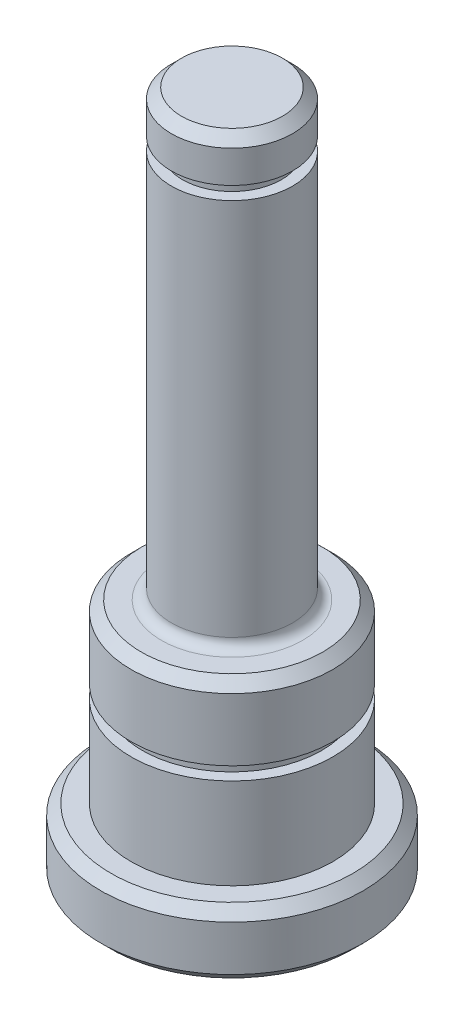
ISO-10303-21;
HEADER;
FILE_DESCRIPTION(('STEP AP214'),'2;1');
FILE_NAME('part.step','',(''),(''),'','','');
FILE_SCHEMA(('AUTOMOTIVE_DESIGN { 1 0 10303 214 1 1 1 1 }'));
ENDSEC;
DATA;
#1=APPLICATION_CONTEXT('core data for automotive mechanical design processes');
#2=APPLICATION_PROTOCOL_DEFINITION('international standard','automotive_design',2000,#1);
#3=PRODUCT_CONTEXT('',#1,'mechanical');
#4=PRODUCT('Part','Part','',(#3));
#5=PRODUCT_RELATED_PRODUCT_CATEGORY('part','',(#4));
#6=PRODUCT_DEFINITION_FORMATION('','',#4);
#7=PRODUCT_DEFINITION_CONTEXT('part definition',#1,'design');
#8=PRODUCT_DEFINITION('design','',#6,#7);
#9=PRODUCT_DEFINITION_SHAPE('','',#8);
#10=(LENGTH_UNIT() NAMED_UNIT(*) SI_UNIT(.MILLI.,.METRE.));
#11=(NAMED_UNIT(*) PLANE_ANGLE_UNIT() SI_UNIT($,.RADIAN.));
#12=(NAMED_UNIT(*) SI_UNIT($,.STERADIAN.) SOLID_ANGLE_UNIT());
#13=UNCERTAINTY_MEASURE_WITH_UNIT(LENGTH_MEASURE(1.E-05),#10,'distance_accuracy_value','');
#14=(GEOMETRIC_REPRESENTATION_CONTEXT(3) GLOBAL_UNCERTAINTY_ASSIGNED_CONTEXT((#13)) GLOBAL_UNIT_ASSIGNED_CONTEXT((#10,
#11,#12)) REPRESENTATION_CONTEXT('',''));
#15=CARTESIAN_POINT('',(0.,0.,0.));
#16=DIRECTION('',(0.,0.,1.));
#17=DIRECTION('',(1.,0.,0.));
#18=AXIS2_PLACEMENT_3D('',#15,#16,#17);
#19=CARTESIAN_POINT('',(-10.,15.5,0.));
#20=DIRECTION('',(0.,-1.,0.));
#21=DIRECTION('',(1.,0.,0.));
#22=AXIS2_PLACEMENT_3D('',#19,#20,#21);
#23=PLANE('',#22);
#24=CARTESIAN_POINT('',(0.,15.5,0.));
#25=DIRECTION('',(0.,-1.,0.));
#26=DIRECTION('',(1.,0.,0.));
#27=AXIS2_PLACEMENT_3D('',#24,#25,#26);
#28=CIRCLE('',#27,10.);
#29=CARTESIAN_POINT('',(10.,15.5,0.));
#30=VERTEX_POINT('',#29);
#31=EDGE_CURVE('E77',#30,#30,#28,.T.);
#32=ORIENTED_EDGE('',*,*,#31,.F.);
#33=EDGE_LOOP('',(#32));
#34=FACE_BOUND('',#33,.T.);
#35=CARTESIAN_POINT('',(0.,15.5,0.));
#36=DIRECTION('',(0.,-1.,0.));
#37=DIRECTION('',(1.,0.,0.));
#38=AXIS2_PLACEMENT_3D('',#35,#36,#37);
#39=CIRCLE('',#38,8.9);
#40=CARTESIAN_POINT('',(8.9,15.5,0.));
#41=VERTEX_POINT('',#40);
#42=EDGE_CURVE('E104',#41,#41,#39,.T.);
#43=ORIENTED_EDGE('',*,*,#42,.T.);
#44=EDGE_LOOP('',(#43));
#45=FACE_BOUND('',#44,.T.);
#46=ADVANCED_FACE('F33',(#34,#45),#23,.F.);
#47=CARTESIAN_POINT('',(0.,0.,0.));
#48=DIRECTION('',(0.,-1.,0.));
#49=DIRECTION('',(1.,0.,0.));
#50=AXIS2_PLACEMENT_3D('',#47,#48,#49);
#51=CYLINDRICAL_SURFACE('',#50,10.);
#52=CARTESIAN_POINT('',(0.,6.5,0.));
#53=DIRECTION('',(0.,-1.,0.));
#54=DIRECTION('',(1.,0.,0.));
#55=AXIS2_PLACEMENT_3D('',#52,#53,#54);
#56=CIRCLE('',#55,10.);
#57=CARTESIAN_POINT('',(10.,6.5,0.));
#58=VERTEX_POINT('',#57);
#59=EDGE_CURVE('E80',#58,#58,#56,.T.);
#60=ORIENTED_EDGE('',*,*,#59,.F.);
#61=EDGE_LOOP('',(#60));
#62=FACE_BOUND('',#61,.T.);
#63=ORIENTED_EDGE('',*,*,#31,.T.);
#64=EDGE_LOOP('',(#63));
#65=FACE_BOUND('',#64,.T.);
#66=ADVANCED_FACE('F133',(#62,#65),#51,.T.);
#67=CARTESIAN_POINT('',(-13.,6.5,0.));
#68=DIRECTION('',(0.,-1.,0.));
#69=DIRECTION('',(1.,0.,0.));
#70=AXIS2_PLACEMENT_3D('',#67,#68,#69);
#71=PLANE('',#70);
#72=CARTESIAN_POINT('',(0.,6.5,0.));
#73=DIRECTION('',(0.,-1.,0.));
#74=DIRECTION('',(1.,0.,0.));
#75=AXIS2_PLACEMENT_3D('',#72,#73,#74);
#76=CIRCLE('',#75,12.);
#77=CARTESIAN_POINT('',(12.,6.5,0.));
#78=VERTEX_POINT('',#77);
#79=EDGE_CURVE('E56',#78,#78,#76,.F.);
#80=ORIENTED_EDGE('',*,*,#79,.T.);
#81=EDGE_LOOP('',(#80));
#82=FACE_BOUND('',#81,.T.);
#83=ORIENTED_EDGE('',*,*,#59,.T.);
#84=EDGE_LOOP('',(#83));
#85=FACE_BOUND('',#84,.T.);
#86=ADVANCED_FACE('F139',(#82,#85),#71,.F.);
#87=CARTESIAN_POINT('',(0.,0.,0.));
#88=DIRECTION('',(0.,-1.,0.));
#89=DIRECTION('',(1.,0.,0.));
#90=AXIS2_PLACEMENT_3D('',#87,#88,#89);
#91=CYLINDRICAL_SURFACE('',#90,13.);
#92=CARTESIAN_POINT('',(0.,5.49999999999999,0.));
#93=DIRECTION('',(0.,-1.,0.));
#94=DIRECTION('',(1.,0.,0.));
#95=AXIS2_PLACEMENT_3D('',#92,#93,#94);
#96=CIRCLE('',#95,13.);
#97=CARTESIAN_POINT('',(13.,5.49999999999999,0.));
#98=VERTEX_POINT('',#97);
#99=EDGE_CURVE('E59',#98,#98,#96,.T.);
#100=ORIENTED_EDGE('',*,*,#99,.T.);
#101=EDGE_LOOP('',(#100));
#102=FACE_BOUND('',#101,.T.);
#103=CARTESIAN_POINT('',(0.,0.999999999999979,0.));
#104=DIRECTION('',(0.,1.,0.));
#105=DIRECTION('',(-1.,0.,0.));
#106=AXIS2_PLACEMENT_3D('',#103,#104,#105);
#107=CIRCLE('',#106,13.);
#108=CARTESIAN_POINT('',(-13.,0.999999999999979,0.));
#109=VERTEX_POINT('',#108);
#110=EDGE_CURVE('E62',#109,#109,#107,.T.);
#111=ORIENTED_EDGE('',*,*,#110,.T.);
#112=EDGE_LOOP('',(#111));
#113=FACE_BOUND('',#112,.T.);
#114=ADVANCED_FACE('F188',(#102,#113),#91,.T.);
#115=CARTESIAN_POINT('',(-5.,0.,0.));
#116=DIRECTION('',(0.,1.,0.));
#117=DIRECTION('',(-1.,0.,0.));
#118=AXIS2_PLACEMENT_3D('',#115,#116,#117);
#119=PLANE('',#118);
#120=CARTESIAN_POINT('',(0.,0.,0.));
#121=DIRECTION('',(0.,1.,0.));
#122=DIRECTION('',(-1.,0.,0.));
#123=AXIS2_PLACEMENT_3D('',#120,#121,#122);
#124=CIRCLE('',#123,6.);
#125=CARTESIAN_POINT('',(-6.,0.,0.));
#126=VERTEX_POINT('',#125);
#127=EDGE_CURVE('E44',#126,#126,#124,.T.);
#128=ORIENTED_EDGE('',*,*,#127,.T.);
#129=EDGE_LOOP('',(#128));
#130=FACE_BOUND('',#129,.T.);
#131=CARTESIAN_POINT('',(0.,0.,0.));
#132=DIRECTION('',(0.,1.,0.));
#133=DIRECTION('',(-1.,0.,0.));
#134=AXIS2_PLACEMENT_3D('',#131,#132,#133);
#135=CIRCLE('',#134,12.);
#136=CARTESIAN_POINT('',(-12.,0.,0.));
#137=VERTEX_POINT('',#136);
#138=EDGE_CURVE('E48',#137,#137,#135,.F.);
#139=ORIENTED_EDGE('',*,*,#138,.T.);
#140=EDGE_LOOP('',(#139));
#141=FACE_BOUND('',#140,.T.);
#142=ADVANCED_FACE('F185',(#130,#141),#119,.F.);
#143=CARTESIAN_POINT('',(0.,0.,0.));
#144=DIRECTION('',(0.,-1.,0.));
#145=DIRECTION('',(1.,0.,0.));
#146=AXIS2_PLACEMENT_3D('',#143,#144,#145);
#147=CYLINDRICAL_SURFACE('',#146,5.);
#148=CARTESIAN_POINT('',(0.,1.,0.));
#149=DIRECTION('',(0.,1.,0.));
#150=DIRECTION('',(-1.,0.,0.));
#151=AXIS2_PLACEMENT_3D('',#148,#149,#150);
#152=CIRCLE('',#151,5.);
#153=CARTESIAN_POINT('',(-5.,1.,0.));
#154=VERTEX_POINT('',#153);
#155=EDGE_CURVE('E53',#154,#154,#152,.F.);
#156=ORIENTED_EDGE('',*,*,#155,.T.);
#157=EDGE_LOOP('',(#156));
#158=FACE_BOUND('',#157,.T.);
#159=CARTESIAN_POINT('',(0.,18.,0.));
#160=DIRECTION('',(0.,-1.,0.));
#161=DIRECTION('',(1.,0.,0.));
#162=AXIS2_PLACEMENT_3D('',#159,#160,#161);
#163=CIRCLE('',#162,5.);
#164=CARTESIAN_POINT('',(5.,18.,0.));
#165=VERTEX_POINT('',#164);
#166=EDGE_CURVE('E83',#165,#165,#163,.T.);
#167=ORIENTED_EDGE('',*,*,#166,.F.);
#168=EDGE_LOOP('',(#167));
#169=FACE_BOUND('',#168,.T.);
#170=ADVANCED_FACE('F187',(#158,#169),#147,.F.);
#171=CARTESIAN_POINT('',(0.,18.,0.));
#172=DIRECTION('',(0.,1.,0.));
#173=DIRECTION('',(-1.,0.,0.));
#174=AXIS2_PLACEMENT_3D('',#171,#172,#173);
#175=PLANE('',#174);
#176=ORIENTED_EDGE('',*,*,#166,.T.);
#177=EDGE_LOOP('',(#176));
#178=FACE_BOUND('',#177,.T.);
#179=ADVANCED_FACE('F195',(#178),#175,.F.);
#180=CARTESIAN_POINT('',(-6.,68.,0.));
#181=DIRECTION('',(0.,-1.,0.));
#182=DIRECTION('',(1.,0.,0.));
#183=AXIS2_PLACEMENT_3D('',#180,#181,#182);
#184=PLANE('',#183);
#185=CARTESIAN_POINT('',(0.,68.,0.));
#186=DIRECTION('',(0.,-1.,0.));
#187=DIRECTION('',(1.,0.,0.));
#188=AXIS2_PLACEMENT_3D('',#185,#186,#187);
#189=CIRCLE('',#188,5.00000000000001);
#190=CARTESIAN_POINT('',(5.00000000000001,68.,0.));
#191=VERTEX_POINT('',#190);
#192=EDGE_CURVE('E71',#191,#191,#189,.F.);
#193=ORIENTED_EDGE('',*,*,#192,.T.);
#194=EDGE_LOOP('',(#193));
#195=FACE_BOUND('',#194,.T.);
#196=ADVANCED_FACE('F236',(#195),#184,.F.);
#197=CARTESIAN_POINT('',(0.,0.,0.));
#198=DIRECTION('',(0.,-1.,0.));
#199=DIRECTION('',(1.,0.,0.));
#200=AXIS2_PLACEMENT_3D('',#197,#198,#199);
#201=CYLINDRICAL_SURFACE('',#200,6.);
#202=CARTESIAN_POINT('',(0.,67.,0.));
#203=DIRECTION('',(0.,-1.,0.));
#204=DIRECTION('',(1.,0.,0.));
#205=AXIS2_PLACEMENT_3D('',#202,#203,#204);
#206=CIRCLE('',#205,6.);
#207=CARTESIAN_POINT('',(6.,67.,0.));
#208=VERTEX_POINT('',#207);
#209=EDGE_CURVE('E74',#208,#208,#206,.T.);
#210=ORIENTED_EDGE('',*,*,#209,.T.);
#211=EDGE_LOOP('',(#210));
#212=FACE_BOUND('',#211,.T.);
#213=CARTESIAN_POINT('',(0.,63.8,0.));
#214=DIRECTION('',(0.,-1.,0.));
#215=DIRECTION('',(1.,0.,0.));
#216=AXIS2_PLACEMENT_3D('',#213,#214,#215);
#217=CIRCLE('',#216,6.);
#218=CARTESIAN_POINT('',(6.,63.8,0.));
#219=VERTEX_POINT('',#218);
#220=EDGE_CURVE('E86',#219,#219,#217,.T.);
#221=ORIENTED_EDGE('',*,*,#220,.F.);
#222=EDGE_LOOP('',(#221));
#223=FACE_BOUND('',#222,.T.);
#224=ADVANCED_FACE('F241',(#212,#223),#201,.T.);
#225=CARTESIAN_POINT('',(-6.,63.8,0.));
#226=DIRECTION('',(0.,1.,0.));
#227=DIRECTION('',(-1.,0.,0.));
#228=AXIS2_PLACEMENT_3D('',#225,#226,#227);
#229=PLANE('',#228);
#230=CARTESIAN_POINT('',(0.,63.8,0.));
#231=DIRECTION('',(0.,-1.,0.));
#232=DIRECTION('',(1.,0.,0.));
#233=AXIS2_PLACEMENT_3D('',#230,#231,#232);
#234=CIRCLE('',#233,4.9);
#235=CARTESIAN_POINT('',(4.9,63.8,0.));
#236=VERTEX_POINT('',#235);
#237=EDGE_CURVE('E89',#236,#236,#234,.T.);
#238=ORIENTED_EDGE('',*,*,#237,.F.);
#239=EDGE_LOOP('',(#238));
#240=FACE_BOUND('',#239,.T.);
#241=ORIENTED_EDGE('',*,*,#220,.T.);
#242=EDGE_LOOP('',(#241));
#243=FACE_BOUND('',#242,.T.);
#244=ADVANCED_FACE('F250',(#240,#243),#229,.F.);
#245=CARTESIAN_POINT('',(0.,0.,0.));
#246=DIRECTION('',(0.,-1.,0.));
#247=DIRECTION('',(1.,0.,0.));
#248=AXIS2_PLACEMENT_3D('',#245,#246,#247);
#249=CYLINDRICAL_SURFACE('',#248,4.9);
#250=CARTESIAN_POINT('',(0.,62.5,0.));
#251=DIRECTION('',(0.,-1.,0.));
#252=DIRECTION('',(1.,0.,0.));
#253=AXIS2_PLACEMENT_3D('',#250,#251,#252);
#254=CIRCLE('',#253,4.9);
#255=CARTESIAN_POINT('',(4.9,62.5,0.));
#256=VERTEX_POINT('',#255);
#257=EDGE_CURVE('E92',#256,#256,#254,.T.);
#258=ORIENTED_EDGE('',*,*,#257,.F.);
#259=EDGE_LOOP('',(#258));
#260=FACE_BOUND('',#259,.T.);
#261=ORIENTED_EDGE('',*,*,#237,.T.);
#262=EDGE_LOOP('',(#261));
#263=FACE_BOUND('',#262,.T.);
#264=ADVANCED_FACE('F318',(#260,#263),#249,.T.);
#265=CARTESIAN_POINT('',(-6.,62.5,0.));
#266=DIRECTION('',(0.,-1.,0.));
#267=DIRECTION('',(1.,0.,0.));
#268=AXIS2_PLACEMENT_3D('',#265,#266,#267);
#269=PLANE('',#268);
#270=CARTESIAN_POINT('',(0.,62.5,0.));
#271=DIRECTION('',(0.,-1.,0.));
#272=DIRECTION('',(1.,0.,0.));
#273=AXIS2_PLACEMENT_3D('',#270,#271,#272);
#274=CIRCLE('',#273,6.);
#275=CARTESIAN_POINT('',(6.,62.5,0.));
#276=VERTEX_POINT('',#275);
#277=EDGE_CURVE('E95',#276,#276,#274,.T.);
#278=ORIENTED_EDGE('',*,*,#277,.F.);
#279=EDGE_LOOP('',(#278));
#280=FACE_BOUND('',#279,.T.);
#281=ORIENTED_EDGE('',*,*,#257,.T.);
#282=EDGE_LOOP('',(#281));
#283=FACE_BOUND('',#282,.T.);
#284=ADVANCED_FACE('F299',(#280,#283),#269,.F.);
#285=CARTESIAN_POINT('',(0.,0.,0.));
#286=DIRECTION('',(0.,-1.,0.));
#287=DIRECTION('',(1.,0.,0.));
#288=AXIS2_PLACEMENT_3D('',#285,#286,#287);
#289=CYLINDRICAL_SURFACE('',#288,6.);
#290=CARTESIAN_POINT('',(0.,25.,0.));
#291=DIRECTION('',(0.,-1.,0.));
#292=DIRECTION('',(1.,0.,0.));
#293=AXIS2_PLACEMENT_3D('',#290,#291,#292);
#294=CIRCLE('',#293,6.);
#295=CARTESIAN_POINT('',(6.,25.,0.));
#296=VERTEX_POINT('',#295);
#297=EDGE_CURVE('E10',#296,#296,#294,.F.);
#298=ORIENTED_EDGE('',*,*,#297,.T.);
#299=EDGE_LOOP('',(#298));
#300=FACE_BOUND('',#299,.T.);
#301=ORIENTED_EDGE('',*,*,#277,.T.);
#302=EDGE_LOOP('',(#301));
#303=FACE_BOUND('',#302,.T.);
#304=ADVANCED_FACE('F130',(#300,#303),#289,.T.);
#305=CARTESIAN_POINT('',(-10.,24.,0.));
#306=DIRECTION('',(0.,-1.,0.));
#307=DIRECTION('',(1.,0.,0.));
#308=AXIS2_PLACEMENT_3D('',#305,#306,#307);
#309=PLANE('',#308);
#310=CARTESIAN_POINT('',(0.,24.,0.));
#311=DIRECTION('',(0.,-1.,0.));
#312=DIRECTION('',(1.,0.,0.));
#313=AXIS2_PLACEMENT_3D('',#310,#311,#312);
#314=CIRCLE('',#313,7.);
#315=CARTESIAN_POINT('',(7.,24.,0.));
#316=VERTEX_POINT('',#315);
#317=EDGE_CURVE('E40',#316,#316,#314,.T.);
#318=ORIENTED_EDGE('',*,*,#317,.T.);
#319=EDGE_LOOP('',(#318));
#320=FACE_BOUND('',#319,.T.);
#321=CARTESIAN_POINT('',(0.,24.,0.));
#322=DIRECTION('',(0.,-1.,0.));
#323=DIRECTION('',(1.,0.,0.));
#324=AXIS2_PLACEMENT_3D('',#321,#322,#323);
#325=CIRCLE('',#324,9.00000000000001);
#326=CARTESIAN_POINT('',(9.00000000000001,24.,0.));
#327=VERTEX_POINT('',#326);
#328=EDGE_CURVE('E65',#327,#327,#325,.F.);
#329=ORIENTED_EDGE('',*,*,#328,.T.);
#330=EDGE_LOOP('',(#329));
#331=FACE_BOUND('',#330,.T.);
#332=ADVANCED_FACE('F124',(#320,#331),#309,.F.);
#333=CARTESIAN_POINT('',(0.,0.,0.));
#334=DIRECTION('',(0.,-1.,0.));
#335=DIRECTION('',(1.,0.,0.));
#336=AXIS2_PLACEMENT_3D('',#333,#334,#335);
#337=CYLINDRICAL_SURFACE('',#336,10.);
#338=CARTESIAN_POINT('',(0.,23.,0.));
#339=DIRECTION('',(0.,-1.,0.));
#340=DIRECTION('',(1.,0.,0.));
#341=AXIS2_PLACEMENT_3D('',#338,#339,#340);
#342=CIRCLE('',#341,10.);
#343=CARTESIAN_POINT('',(10.,23.,0.));
#344=VERTEX_POINT('',#343);
#345=EDGE_CURVE('E68',#344,#344,#342,.T.);
#346=ORIENTED_EDGE('',*,*,#345,.T.);
#347=EDGE_LOOP('',(#346));
#348=FACE_BOUND('',#347,.T.);
#349=CARTESIAN_POINT('',(0.,16.8,0.));
#350=DIRECTION('',(0.,-1.,0.));
#351=DIRECTION('',(1.,0.,0.));
#352=AXIS2_PLACEMENT_3D('',#349,#350,#351);
#353=CIRCLE('',#352,10.);
#354=CARTESIAN_POINT('',(10.,16.8,0.));
#355=VERTEX_POINT('',#354);
#356=EDGE_CURVE('E98',#355,#355,#353,.T.);
#357=ORIENTED_EDGE('',*,*,#356,.F.);
#358=EDGE_LOOP('',(#357));
#359=FACE_BOUND('',#358,.T.);
#360=ADVANCED_FACE('F119',(#348,#359),#337,.T.);
#361=CARTESIAN_POINT('',(-10.,16.8,0.));
#362=DIRECTION('',(0.,1.,0.));
#363=DIRECTION('',(-1.,0.,0.));
#364=AXIS2_PLACEMENT_3D('',#361,#362,#363);
#365=PLANE('',#364);
#366=CARTESIAN_POINT('',(0.,16.8,0.));
#367=DIRECTION('',(0.,-1.,0.));
#368=DIRECTION('',(1.,0.,0.));
#369=AXIS2_PLACEMENT_3D('',#366,#367,#368);
#370=CIRCLE('',#369,8.9);
#371=CARTESIAN_POINT('',(8.9,16.8,0.));
#372=VERTEX_POINT('',#371);
#373=EDGE_CURVE('E101',#372,#372,#370,.T.);
#374=ORIENTED_EDGE('',*,*,#373,.F.);
#375=EDGE_LOOP('',(#374));
#376=FACE_BOUND('',#375,.T.);
#377=ORIENTED_EDGE('',*,*,#356,.T.);
#378=EDGE_LOOP('',(#377));
#379=FACE_BOUND('',#378,.T.);
#380=ADVANCED_FACE('F113',(#376,#379),#365,.F.);
#381=CARTESIAN_POINT('',(0.,0.,0.));
#382=DIRECTION('',(0.,-1.,0.));
#383=DIRECTION('',(1.,0.,0.));
#384=AXIS2_PLACEMENT_3D('',#381,#382,#383);
#385=CYLINDRICAL_SURFACE('',#384,8.9);
#386=ORIENTED_EDGE('',*,*,#42,.F.);
#387=EDGE_LOOP('',(#386));
#388=FACE_BOUND('',#387,.T.);
#389=ORIENTED_EDGE('',*,*,#373,.T.);
#390=EDGE_LOOP('',(#389));
#391=FACE_BOUND('',#390,.T.);
#392=ADVANCED_FACE('F109',(#388,#391),#385,.T.);
#393=CARTESIAN_POINT('',(0.,67.,0.));
#394=DIRECTION('',(0.,-1.,0.));
#395=DIRECTION('',(1.,0.,0.));
#396=AXIS2_PLACEMENT_3D('',#393,#394,#395);
#397=CONICAL_SURFACE('',#396,6.,0.78539816339745);
#398=ORIENTED_EDGE('',*,*,#192,.F.);
#399=EDGE_LOOP('',(#398));
#400=FACE_BOUND('',#399,.T.);
#401=ORIENTED_EDGE('',*,*,#209,.F.);
#402=EDGE_LOOP('',(#401));
#403=FACE_BOUND('',#402,.T.);
#404=ADVANCED_FACE('F112',(#400,#403),#397,.T.);
#405=CARTESIAN_POINT('',(0.,23.,0.));
#406=DIRECTION('',(0.,-1.,0.));
#407=DIRECTION('',(1.,0.,0.));
#408=AXIS2_PLACEMENT_3D('',#405,#406,#407);
#409=CONICAL_SURFACE('',#408,10.,0.785398163397447);
#410=ORIENTED_EDGE('',*,*,#328,.F.);
#411=EDGE_LOOP('',(#410));
#412=FACE_BOUND('',#411,.T.);
#413=ORIENTED_EDGE('',*,*,#345,.F.);
#414=EDGE_LOOP('',(#413));
#415=FACE_BOUND('',#414,.T.);
#416=ADVANCED_FACE('F151',(#412,#415),#409,.T.);
#417=CARTESIAN_POINT('',(0.,5.49999999999999,0.));
#418=DIRECTION('',(0.,-1.,0.));
#419=DIRECTION('',(1.,0.,0.));
#420=AXIS2_PLACEMENT_3D('',#417,#418,#419);
#421=CONICAL_SURFACE('',#420,13.,0.785398163397451);
#422=ORIENTED_EDGE('',*,*,#79,.F.);
#423=EDGE_LOOP('',(#422));
#424=FACE_BOUND('',#423,.T.);
#425=ORIENTED_EDGE('',*,*,#99,.F.);
#426=EDGE_LOOP('',(#425));
#427=FACE_BOUND('',#426,.T.);
#428=ADVANCED_FACE('F158',(#424,#427),#421,.T.);
#429=CARTESIAN_POINT('',(0.,1.,0.));
#430=DIRECTION('',(0.,-1.,0.));
#431=DIRECTION('',(1.,0.,0.));
#432=AXIS2_PLACEMENT_3D('',#429,#430,#431);
#433=CONICAL_SURFACE('',#432,5.,0.785398163397447);
#434=ORIENTED_EDGE('',*,*,#127,.F.);
#435=EDGE_LOOP('',(#434));
#436=FACE_BOUND('',#435,.T.);
#437=ORIENTED_EDGE('',*,*,#155,.F.);
#438=EDGE_LOOP('',(#437));
#439=FACE_BOUND('',#438,.T.);
#440=ADVANCED_FACE('F165',(#436,#439),#433,.F.);
#441=CARTESIAN_POINT('',(0.,0.,0.));
#442=DIRECTION('',(0.,1.,0.));
#443=DIRECTION('',(-1.,0.,0.));
#444=AXIS2_PLACEMENT_3D('',#441,#442,#443);
#445=CONICAL_SURFACE('',#444,12.,0.785398163397449);
#446=ORIENTED_EDGE('',*,*,#110,.F.);
#447=EDGE_LOOP('',(#446));
#448=FACE_BOUND('',#447,.T.);
#449=ORIENTED_EDGE('',*,*,#138,.F.);
#450=EDGE_LOOP('',(#449));
#451=FACE_BOUND('',#450,.T.);
#452=ADVANCED_FACE('F171',(#448,#451),#445,.T.);
#453=CARTESIAN_POINT('',(0.,25.,0.));
#454=DIRECTION('',(0.,-1.,0.));
#455=DIRECTION('',(1.,0.,0.));
#456=AXIS2_PLACEMENT_3D('',#453,#454,#455);
#457=TOROIDAL_SURFACE('',#456,7.,1.);
#458=ORIENTED_EDGE('',*,*,#297,.F.);
#459=EDGE_LOOP('',(#458));
#460=FACE_BOUND('',#459,.T.);
#461=ORIENTED_EDGE('',*,*,#317,.F.);
#462=EDGE_LOOP('',(#461));
#463=FACE_BOUND('',#462,.T.);
#464=ADVANCED_FACE('F35',(#460,#463),#457,.F.);
#465=CLOSED_SHELL('',(#46,#66,#86,#114,#142,#170,#179,#196,#224,#244,#264,#284,#304,#332,#360,
#380,#392,#404,#416,#428,#440,#452,#464));
#466=MANIFOLD_SOLID_BREP('B2',#465);
#467=ADVANCED_BREP_SHAPE_REPRESENTATION('',(#18,#466),#14);
#468=SHAPE_DEFINITION_REPRESENTATION(#9,#467);
ENDSEC;
END-ISO-10303-21;
